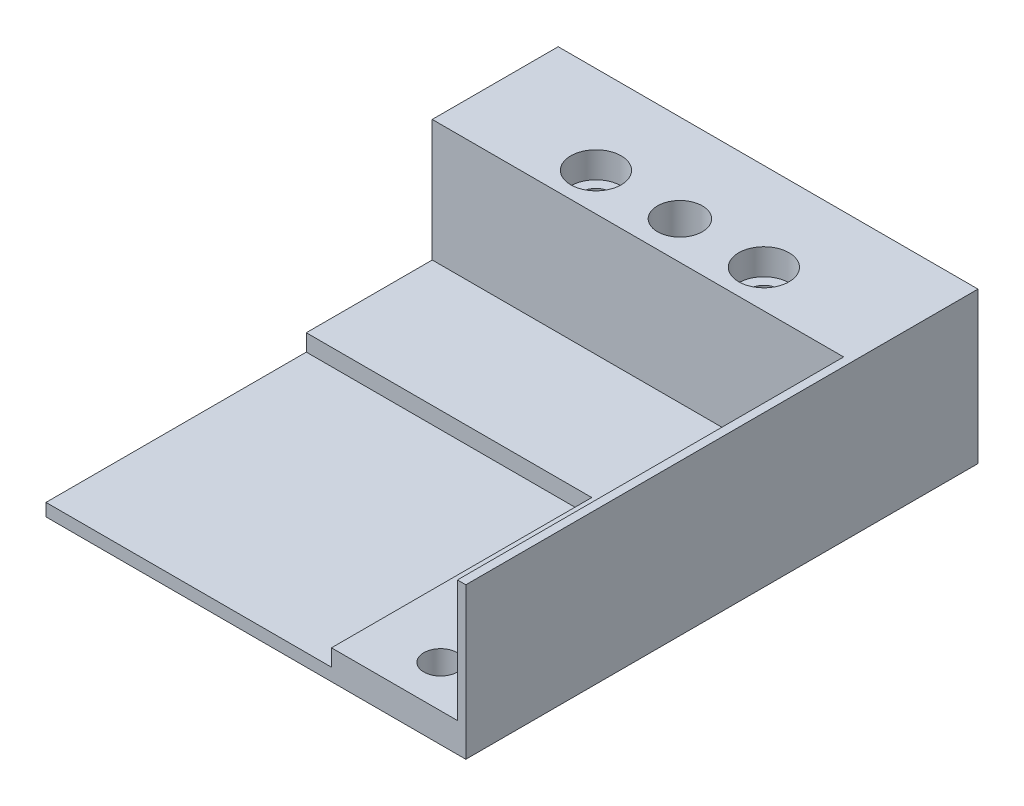
ISO-10303-21;
HEADER;
FILE_DESCRIPTION(('STEP AP214'),'2;1');
FILE_NAME('part.step','',(''),(''),'','','');
FILE_SCHEMA(('AUTOMOTIVE_DESIGN { 1 0 10303 214 1 1 1 1 }'));
ENDSEC;
DATA;
#1=APPLICATION_CONTEXT('core data for automotive mechanical design processes');
#2=APPLICATION_PROTOCOL_DEFINITION('international standard','automotive_design',2000,#1);
#3=PRODUCT_CONTEXT('',#1,'mechanical');
#4=PRODUCT('Part','Part','',(#3));
#5=PRODUCT_RELATED_PRODUCT_CATEGORY('part','',(#4));
#6=PRODUCT_DEFINITION_FORMATION('','',#4);
#7=PRODUCT_DEFINITION_CONTEXT('part definition',#1,'design');
#8=PRODUCT_DEFINITION('design','',#6,#7);
#9=PRODUCT_DEFINITION_SHAPE('','',#8);
#10=(LENGTH_UNIT() NAMED_UNIT(*) SI_UNIT(.MILLI.,.METRE.));
#11=(NAMED_UNIT(*) PLANE_ANGLE_UNIT() SI_UNIT($,.RADIAN.));
#12=(NAMED_UNIT(*) SI_UNIT($,.STERADIAN.) SOLID_ANGLE_UNIT());
#13=UNCERTAINTY_MEASURE_WITH_UNIT(LENGTH_MEASURE(1.E-05),#10,'distance_accuracy_value','');
#14=(GEOMETRIC_REPRESENTATION_CONTEXT(3) GLOBAL_UNCERTAINTY_ASSIGNED_CONTEXT((#13)) GLOBAL_UNIT_ASSIGNED_CONTEXT((#10,
#11,#12)) REPRESENTATION_CONTEXT('',''));
#15=CARTESIAN_POINT('',(0.,0.,0.));
#16=DIRECTION('',(0.,0.,1.));
#17=DIRECTION('',(1.,0.,0.));
#18=AXIS2_PLACEMENT_3D('',#15,#16,#17);
#19=CARTESIAN_POINT('',(25.,0.,-50.5));
#20=DIRECTION('',(0.,1.,0.));
#21=DIRECTION('',(0.,0.,1.));
#22=AXIS2_PLACEMENT_3D('',#19,#20,#21);
#23=CYLINDRICAL_SURFACE('',#22,2.675);
#24=CARTESIAN_POINT('',(25.,18.,-50.5));
#25=DIRECTION('',(0.,1.,0.));
#26=DIRECTION('',(0.,0.,1.));
#27=AXIS2_PLACEMENT_3D('',#24,#25,#26);
#28=CIRCLE('',#27,2.675);
#29=CARTESIAN_POINT('',(25.,18.,-47.825));
#30=VERTEX_POINT('',#29);
#31=EDGE_CURVE('E190',#30,#30,#28,.T.);
#32=ORIENTED_EDGE('',*,*,#31,.T.);
#33=EDGE_LOOP('',(#32));
#34=FACE_BOUND('',#33,.T.);
#35=CARTESIAN_POINT('',(25.,7.5,-50.5));
#36=DIRECTION('',(0.,-1.,0.));
#37=DIRECTION('',(0.,0.,-1.));
#38=AXIS2_PLACEMENT_3D('',#35,#36,#37);
#39=CIRCLE('',#38,2.675);
#40=CARTESIAN_POINT('',(25.,7.5,-53.175));
#41=VERTEX_POINT('',#40);
#42=EDGE_CURVE('E49',#41,#41,#39,.F.);
#43=ORIENTED_EDGE('',*,*,#42,.F.);
#44=EDGE_LOOP('',(#43));
#45=FACE_BOUND('',#44,.T.);
#46=ADVANCED_FACE('F45',(#34,#45),#23,.F.);
#47=CARTESIAN_POINT('',(15.,0.,-50.5));
#48=DIRECTION('',(0.,1.,0.));
#49=DIRECTION('',(0.,0.,1.));
#50=AXIS2_PLACEMENT_3D('',#47,#48,#49);
#51=CYLINDRICAL_SURFACE('',#50,1.75);
#52=CARTESIAN_POINT('',(15.,0.,-50.5));
#53=DIRECTION('',(0.,1.,0.));
#54=DIRECTION('',(0.,0.,1.));
#55=AXIS2_PLACEMENT_3D('',#52,#53,#54);
#56=CIRCLE('',#55,1.75);
#57=CARTESIAN_POINT('',(15.,0.,-48.75));
#58=VERTEX_POINT('',#57);
#59=EDGE_CURVE('E186',#58,#58,#56,.T.);
#60=ORIENTED_EDGE('',*,*,#59,.F.);
#61=EDGE_LOOP('',(#60));
#62=FACE_BOUND('',#61,.T.);
#63=CARTESIAN_POINT('',(15.,14.9,-50.5));
#64=DIRECTION('',(0.,1.,0.));
#65=DIRECTION('',(0.,0.,1.));
#66=AXIS2_PLACEMENT_3D('',#63,#64,#65);
#67=CIRCLE('',#66,1.75);
#68=CARTESIAN_POINT('',(15.,14.9,-48.75));
#69=VERTEX_POINT('',#68);
#70=EDGE_CURVE('E183',#69,#69,#67,.F.);
#71=ORIENTED_EDGE('',*,*,#70,.F.);
#72=EDGE_LOOP('',(#71));
#73=FACE_BOUND('',#72,.T.);
#74=ADVANCED_FACE('F270',(#62,#73),#51,.F.);
#75=CARTESIAN_POINT('',(35.,0.,-50.5));
#76=DIRECTION('',(0.,1.,0.));
#77=DIRECTION('',(0.,0.,1.));
#78=AXIS2_PLACEMENT_3D('',#75,#76,#77);
#79=CYLINDRICAL_SURFACE('',#78,1.75);
#80=CARTESIAN_POINT('',(35.,0.,-50.5));
#81=DIRECTION('',(0.,1.,0.));
#82=DIRECTION('',(0.,0.,1.));
#83=AXIS2_PLACEMENT_3D('',#80,#81,#82);
#84=CIRCLE('',#83,1.75);
#85=CARTESIAN_POINT('',(35.,0.,-48.75));
#86=VERTEX_POINT('',#85);
#87=EDGE_CURVE('E195',#86,#86,#84,.T.);
#88=ORIENTED_EDGE('',*,*,#87,.F.);
#89=EDGE_LOOP('',(#88));
#90=FACE_BOUND('',#89,.T.);
#91=CARTESIAN_POINT('',(35.,14.9,-50.5));
#92=DIRECTION('',(0.,1.,0.));
#93=DIRECTION('',(0.,0.,1.));
#94=AXIS2_PLACEMENT_3D('',#91,#92,#93);
#95=CIRCLE('',#94,1.75);
#96=CARTESIAN_POINT('',(35.,14.9,-48.75));
#97=VERTEX_POINT('',#96);
#98=EDGE_CURVE('E181',#97,#97,#95,.F.);
#99=ORIENTED_EDGE('',*,*,#98,.F.);
#100=EDGE_LOOP('',(#99));
#101=FACE_BOUND('',#100,.T.);
#102=ADVANCED_FACE('F277',(#90,#101),#79,.F.);
#103=CARTESIAN_POINT('',(0.,18.,0.));
#104=DIRECTION('',(0.,-1.,0.));
#105=DIRECTION('',(0.,0.,-1.));
#106=AXIS2_PLACEMENT_3D('',#103,#104,#105);
#107=PLANE('',#106);
#108=CARTESIAN_POINT('',(35.,18.,-50.5));
#109=DIRECTION('',(0.,1.,0.));
#110=DIRECTION('',(0.,0.,1.));
#111=AXIS2_PLACEMENT_3D('',#108,#109,#110);
#112=CIRCLE('',#111,3.);
#113=CARTESIAN_POINT('',(35.,18.,-47.5));
#114=VERTEX_POINT('',#113);
#115=EDGE_CURVE('E426',#114,#114,#112,.T.);
#116=ORIENTED_EDGE('',*,*,#115,.F.);
#117=EDGE_LOOP('',(#116));
#118=FACE_BOUND('',#117,.T.);
#119=CARTESIAN_POINT('',(15.,18.,-50.5));
#120=DIRECTION('',(0.,1.,0.));
#121=DIRECTION('',(0.,0.,1.));
#122=AXIS2_PLACEMENT_3D('',#119,#120,#121);
#123=CIRCLE('',#122,3.);
#124=CARTESIAN_POINT('',(15.,18.,-47.5));
#125=VERTEX_POINT('',#124);
#126=EDGE_CURVE('E429',#125,#125,#123,.T.);
#127=ORIENTED_EDGE('',*,*,#126,.F.);
#128=EDGE_LOOP('',(#127));
#129=FACE_BOUND('',#128,.T.);
#130=ORIENTED_EDGE('',*,*,#31,.F.);
#131=EDGE_LOOP('',(#130));
#132=FACE_BOUND('',#131,.T.);
#133=DIRECTION('',(0.,0.,1.));
#134=VECTOR('',#133,1.);
#135=CARTESIAN_POINT('',(0.,18.,0.));
#136=LINE('',#135,#134);
#137=CARTESIAN_POINT('',(0.,18.,-61.));
#138=VERTEX_POINT('',#137);
#139=CARTESIAN_POINT('',(0.,18.,-46.));
#140=VERTEX_POINT('',#139);
#141=EDGE_CURVE('E172',#138,#140,#136,.T.);
#142=ORIENTED_EDGE('',*,*,#141,.T.);
#143=DIRECTION('',(-1.,0.,0.));
#144=VECTOR('',#143,1.);
#145=CARTESIAN_POINT('',(0.,18.,-46.));
#146=LINE('',#145,#144);
#147=CARTESIAN_POINT('',(49.,18.,-46.));
#148=VERTEX_POINT('',#147);
#149=EDGE_CURVE('E214',#148,#140,#146,.T.);
#150=ORIENTED_EDGE('',*,*,#149,.F.);
#151=DIRECTION('',(0.,0.,-1.));
#152=VECTOR('',#151,1.);
#153=CARTESIAN_POINT('',(49.,18.,0.));
#154=LINE('',#153,#152);
#155=CARTESIAN_POINT('',(49.,18.,0.));
#156=VERTEX_POINT('',#155);
#157=EDGE_CURVE('E206',#156,#148,#154,.T.);
#158=ORIENTED_EDGE('',*,*,#157,.F.);
#159=DIRECTION('',(1.,0.,0.));
#160=VECTOR('',#159,1.);
#161=CARTESIAN_POINT('',(0.,18.,0.));
#162=LINE('',#161,#160);
#163=CARTESIAN_POINT('',(50.,18.,0.));
#164=VERTEX_POINT('',#163);
#165=EDGE_CURVE('E95',#156,#164,#162,.T.);
#166=ORIENTED_EDGE('',*,*,#165,.T.);
#167=DIRECTION('',(0.,0.,-1.));
#168=VECTOR('',#167,1.);
#169=CARTESIAN_POINT('',(50.,18.,0.));
#170=LINE('',#169,#168);
#171=CARTESIAN_POINT('',(50.,18.,-61.));
#172=VERTEX_POINT('',#171);
#173=EDGE_CURVE('E232',#164,#172,#170,.T.);
#174=ORIENTED_EDGE('',*,*,#173,.T.);
#175=DIRECTION('',(-1.,0.,0.));
#176=VECTOR('',#175,1.);
#177=CARTESIAN_POINT('',(0.,18.,-61.));
#178=LINE('',#177,#176);
#179=EDGE_CURVE('E71',#172,#138,#178,.T.);
#180=ORIENTED_EDGE('',*,*,#179,.T.);
#181=EDGE_LOOP('',(#142,#150,#158,#166,#174,#180));
#182=FACE_BOUND('',#181,.T.);
#183=ADVANCED_FACE('F235',(#118,#129,#132,#182),#107,.F.);
#184=CARTESIAN_POINT('',(0.,0.,0.));
#185=DIRECTION('',(0.,-1.,0.));
#186=DIRECTION('',(0.,0.,-1.));
#187=AXIS2_PLACEMENT_3D('',#184,#185,#186);
#188=PLANE('',#187);
#189=CARTESIAN_POINT('',(25.,0.,-50.5));
#190=DIRECTION('',(0.,-1.,0.));
#191=DIRECTION('',(0.,0.,-1.));
#192=AXIS2_PLACEMENT_3D('',#189,#190,#191);
#193=CIRCLE('',#192,4.125);
#194=CARTESIAN_POINT('',(25.,0.,-54.625));
#195=VERTEX_POINT('',#194);
#196=EDGE_CURVE('E420',#195,#195,#193,.T.);
#197=ORIENTED_EDGE('',*,*,#196,.F.);
#198=EDGE_LOOP('',(#197));
#199=FACE_BOUND('',#198,.T.);
#200=ORIENTED_EDGE('',*,*,#87,.T.);
#201=EDGE_LOOP('',(#200));
#202=FACE_BOUND('',#201,.T.);
#203=ORIENTED_EDGE('',*,*,#59,.T.);
#204=EDGE_LOOP('',(#203));
#205=FACE_BOUND('',#204,.T.);
#206=DIRECTION('',(0.,0.,1.));
#207=VECTOR('',#206,1.);
#208=CARTESIAN_POINT('',(0.,0.,0.));
#209=LINE('',#208,#207);
#210=CARTESIAN_POINT('',(0.,0.,-61.));
#211=VERTEX_POINT('',#210);
#212=CARTESIAN_POINT('',(0.,0.,0.));
#213=VERTEX_POINT('',#212);
#214=EDGE_CURVE('E155',#211,#213,#209,.T.);
#215=ORIENTED_EDGE('',*,*,#214,.F.);
#216=DIRECTION('',(-1.,0.,0.));
#217=VECTOR('',#216,1.);
#218=CARTESIAN_POINT('',(0.,0.,-61.));
#219=LINE('',#218,#217);
#220=CARTESIAN_POINT('',(50.,0.,-61.));
#221=VERTEX_POINT('',#220);
#222=EDGE_CURVE('E90',#221,#211,#219,.T.);
#223=ORIENTED_EDGE('',*,*,#222,.F.);
#224=DIRECTION('',(0.,0.,-1.));
#225=VECTOR('',#224,1.);
#226=CARTESIAN_POINT('',(50.,0.,0.));
#227=LINE('',#226,#225);
#228=CARTESIAN_POINT('',(50.,0.,0.));
#229=VERTEX_POINT('',#228);
#230=EDGE_CURVE('E162',#229,#221,#227,.T.);
#231=ORIENTED_EDGE('',*,*,#230,.F.);
#232=DIRECTION('',(1.,0.,0.));
#233=VECTOR('',#232,1.);
#234=CARTESIAN_POINT('',(0.,0.,0.));
#235=LINE('',#234,#233);
#236=EDGE_CURVE('E159',#213,#229,#235,.T.);
#237=ORIENTED_EDGE('',*,*,#236,.F.);
#238=EDGE_LOOP('',(#215,#223,#231,#237));
#239=FACE_BOUND('',#238,.T.);
#240=CARTESIAN_POINT('',(42.,0.,-5.));
#241=DIRECTION('',(0.,1.,0.));
#242=DIRECTION('',(0.,0.,1.));
#243=AXIS2_PLACEMENT_3D('',#240,#241,#242);
#244=CIRCLE('',#243,2.);
#245=CARTESIAN_POINT('',(42.,0.,-3.));
#246=VERTEX_POINT('',#245);
#247=EDGE_CURVE('E160',#246,#246,#244,.T.);
#248=ORIENTED_EDGE('',*,*,#247,.T.);
#249=EDGE_LOOP('',(#248));
#250=FACE_BOUND('',#249,.T.);
#251=ADVANCED_FACE('F249',(#199,#202,#205,#239,#250),#188,.T.);
#252=CARTESIAN_POINT('',(0.,18.,0.));
#253=DIRECTION('',(1.,0.,0.));
#254=DIRECTION('',(0.,0.,-1.));
#255=AXIS2_PLACEMENT_3D('',#252,#253,#254);
#256=PLANE('',#255);
#257=DIRECTION('',(0.,0.,1.));
#258=VECTOR('',#257,1.);
#259=CARTESIAN_POINT('',(0.,1.5,0.));
#260=LINE('',#259,#258);
#261=CARTESIAN_POINT('',(0.,1.5,-31.));
#262=VERTEX_POINT('',#261);
#263=CARTESIAN_POINT('',(0.,1.5,0.));
#264=VERTEX_POINT('',#263);
#265=EDGE_CURVE('E135',#262,#264,#260,.T.);
#266=ORIENTED_EDGE('',*,*,#265,.F.);
#267=DIRECTION('',(0.,1.,0.));
#268=VECTOR('',#267,1.);
#269=CARTESIAN_POINT('',(0.,1.5,-31.));
#270=LINE('',#269,#268);
#271=CARTESIAN_POINT('',(0.,3.5,-31.));
#272=VERTEX_POINT('',#271);
#273=EDGE_CURVE('E204',#262,#272,#270,.T.);
#274=ORIENTED_EDGE('',*,*,#273,.T.);
#275=DIRECTION('',(0.,0.,1.));
#276=VECTOR('',#275,1.);
#277=CARTESIAN_POINT('',(0.,3.5,0.));
#278=LINE('',#277,#276);
#279=CARTESIAN_POINT('',(0.,3.5,-46.));
#280=VERTEX_POINT('',#279);
#281=EDGE_CURVE('E210',#280,#272,#278,.T.);
#282=ORIENTED_EDGE('',*,*,#281,.F.);
#283=DIRECTION('',(0.,1.,0.));
#284=VECTOR('',#283,1.);
#285=CARTESIAN_POINT('',(0.,3.5,-46.));
#286=LINE('',#285,#284);
#287=EDGE_CURVE('E180',#280,#140,#286,.T.);
#288=ORIENTED_EDGE('',*,*,#287,.T.);
#289=ORIENTED_EDGE('',*,*,#141,.F.);
#290=DIRECTION('',(0.,-1.,0.));
#291=VECTOR('',#290,1.);
#292=CARTESIAN_POINT('',(0.,18.,-61.));
#293=LINE('',#292,#291);
#294=EDGE_CURVE('E157',#138,#211,#293,.T.);
#295=ORIENTED_EDGE('',*,*,#294,.T.);
#296=ORIENTED_EDGE('',*,*,#214,.T.);
#297=DIRECTION('',(0.,-1.,0.));
#298=VECTOR('',#297,1.);
#299=CARTESIAN_POINT('',(0.,18.,0.));
#300=LINE('',#299,#298);
#301=EDGE_CURVE('E11',#264,#213,#300,.T.);
#302=ORIENTED_EDGE('',*,*,#301,.F.);
#303=EDGE_LOOP('',(#266,#274,#282,#288,#289,#295,#296,#302));
#304=FACE_BOUND('',#303,.T.);
#305=ADVANCED_FACE('F47',(#304),#256,.F.);
#306=CARTESIAN_POINT('',(0.,18.,0.));
#307=DIRECTION('',(0.,0.,-1.));
#308=DIRECTION('',(-1.,0.,0.));
#309=AXIS2_PLACEMENT_3D('',#306,#307,#308);
#310=PLANE('',#309);
#311=DIRECTION('',(1.,0.,0.));
#312=VECTOR('',#311,1.);
#313=CARTESIAN_POINT('',(0.,3.5,0.));
#314=LINE('',#313,#312);
#315=CARTESIAN_POINT('',(34.,3.5,0.));
#316=VERTEX_POINT('',#315);
#317=CARTESIAN_POINT('',(49.,3.5,0.));
#318=VERTEX_POINT('',#317);
#319=EDGE_CURVE('E213',#316,#318,#314,.T.);
#320=ORIENTED_EDGE('',*,*,#319,.F.);
#321=DIRECTION('',(0.,1.,0.));
#322=VECTOR('',#321,1.);
#323=CARTESIAN_POINT('',(34.,1.5,0.));
#324=LINE('',#323,#322);
#325=CARTESIAN_POINT('',(34.,1.5,0.));
#326=VERTEX_POINT('',#325);
#327=EDGE_CURVE('E62',#326,#316,#324,.T.);
#328=ORIENTED_EDGE('',*,*,#327,.F.);
#329=DIRECTION('',(1.,0.,0.));
#330=VECTOR('',#329,1.);
#331=CARTESIAN_POINT('',(0.,1.5,0.));
#332=LINE('',#331,#330);
#333=EDGE_CURVE('E139',#264,#326,#332,.T.);
#334=ORIENTED_EDGE('',*,*,#333,.F.);
#335=ORIENTED_EDGE('',*,*,#301,.T.);
#336=ORIENTED_EDGE('',*,*,#236,.T.);
#337=DIRECTION('',(0.,-1.,0.));
#338=VECTOR('',#337,1.);
#339=CARTESIAN_POINT('',(50.,18.,0.));
#340=LINE('',#339,#338);
#341=EDGE_CURVE('E54',#164,#229,#340,.T.);
#342=ORIENTED_EDGE('',*,*,#341,.F.);
#343=ORIENTED_EDGE('',*,*,#165,.F.);
#344=DIRECTION('',(0.,1.,0.));
#345=VECTOR('',#344,1.);
#346=CARTESIAN_POINT('',(49.,3.5,0.));
#347=LINE('',#346,#345);
#348=EDGE_CURVE('E222',#318,#156,#347,.T.);
#349=ORIENTED_EDGE('',*,*,#348,.F.);
#350=EDGE_LOOP('',(#320,#328,#334,#335,#336,#342,#343,#349));
#351=FACE_BOUND('',#350,.T.);
#352=ADVANCED_FACE('F149',(#351),#310,.F.);
#353=CARTESIAN_POINT('',(50.,18.,0.));
#354=DIRECTION('',(-1.,0.,0.));
#355=DIRECTION('',(0.,0.,1.));
#356=AXIS2_PLACEMENT_3D('',#353,#354,#355);
#357=PLANE('',#356);
#358=ORIENTED_EDGE('',*,*,#230,.T.);
#359=DIRECTION('',(0.,-1.,0.));
#360=VECTOR('',#359,1.);
#361=CARTESIAN_POINT('',(50.,18.,-61.));
#362=LINE('',#361,#360);
#363=EDGE_CURVE('E174',#172,#221,#362,.T.);
#364=ORIENTED_EDGE('',*,*,#363,.F.);
#365=ORIENTED_EDGE('',*,*,#173,.F.);
#366=ORIENTED_EDGE('',*,*,#341,.T.);
#367=EDGE_LOOP('',(#358,#364,#365,#366));
#368=FACE_BOUND('',#367,.T.);
#369=ADVANCED_FACE('F237',(#368),#357,.F.);
#370=CARTESIAN_POINT('',(0.,18.,-61.));
#371=DIRECTION('',(0.,0.,1.));
#372=DIRECTION('',(1.,0.,0.));
#373=AXIS2_PLACEMENT_3D('',#370,#371,#372);
#374=PLANE('',#373);
#375=ORIENTED_EDGE('',*,*,#222,.T.);
#376=ORIENTED_EDGE('',*,*,#294,.F.);
#377=ORIENTED_EDGE('',*,*,#179,.F.);
#378=ORIENTED_EDGE('',*,*,#363,.T.);
#379=EDGE_LOOP('',(#375,#376,#377,#378));
#380=FACE_BOUND('',#379,.T.);
#381=ADVANCED_FACE('F239',(#380),#374,.F.);
#382=CARTESIAN_POINT('',(42.,18.,-5.));
#383=DIRECTION('',(0.,-1.,0.));
#384=DIRECTION('',(0.,0.,-1.));
#385=AXIS2_PLACEMENT_3D('',#382,#383,#384);
#386=CYLINDRICAL_SURFACE('',#385,2.);
#387=CARTESIAN_POINT('',(42.,3.5,-5.));
#388=DIRECTION('',(0.,-1.,0.));
#389=DIRECTION('',(0.,0.,-1.));
#390=AXIS2_PLACEMENT_3D('',#387,#388,#389);
#391=CIRCLE('',#390,2.);
#392=CARTESIAN_POINT('',(42.,3.5,-7.));
#393=VERTEX_POINT('',#392);
#394=EDGE_CURVE('E165',#393,#393,#391,.T.);
#395=ORIENTED_EDGE('',*,*,#394,.F.);
#396=EDGE_LOOP('',(#395));
#397=FACE_BOUND('',#396,.T.);
#398=ORIENTED_EDGE('',*,*,#247,.F.);
#399=EDGE_LOOP('',(#398));
#400=FACE_BOUND('',#399,.T.);
#401=ADVANCED_FACE('F256',(#397,#400),#386,.F.);
#402=CARTESIAN_POINT('',(0.,3.5,-46.));
#403=DIRECTION('',(0.,0.,-1.));
#404=DIRECTION('',(-1.,0.,0.));
#405=AXIS2_PLACEMENT_3D('',#402,#403,#404);
#406=PLANE('',#405);
#407=ORIENTED_EDGE('',*,*,#149,.T.);
#408=ORIENTED_EDGE('',*,*,#287,.F.);
#409=DIRECTION('',(-1.,0.,0.));
#410=VECTOR('',#409,1.);
#411=CARTESIAN_POINT('',(0.,3.5,-46.));
#412=LINE('',#411,#410);
#413=CARTESIAN_POINT('',(49.,3.5,-46.));
#414=VERTEX_POINT('',#413);
#415=EDGE_CURVE('E219',#414,#280,#412,.T.);
#416=ORIENTED_EDGE('',*,*,#415,.F.);
#417=DIRECTION('',(0.,1.,0.));
#418=VECTOR('',#417,1.);
#419=CARTESIAN_POINT('',(49.,3.5,-46.));
#420=LINE('',#419,#418);
#421=EDGE_CURVE('E228',#414,#148,#420,.T.);
#422=ORIENTED_EDGE('',*,*,#421,.T.);
#423=EDGE_LOOP('',(#407,#408,#416,#422));
#424=FACE_BOUND('',#423,.T.);
#425=ADVANCED_FACE('F243',(#424),#406,.F.);
#426=CARTESIAN_POINT('',(49.,3.5,0.));
#427=DIRECTION('',(1.,0.,0.));
#428=DIRECTION('',(0.,0.,-1.));
#429=AXIS2_PLACEMENT_3D('',#426,#427,#428);
#430=PLANE('',#429);
#431=ORIENTED_EDGE('',*,*,#157,.T.);
#432=ORIENTED_EDGE('',*,*,#421,.F.);
#433=DIRECTION('',(0.,0.,-1.));
#434=VECTOR('',#433,1.);
#435=CARTESIAN_POINT('',(49.,3.5,0.));
#436=LINE('',#435,#434);
#437=EDGE_CURVE('E216',#318,#414,#436,.T.);
#438=ORIENTED_EDGE('',*,*,#437,.F.);
#439=ORIENTED_EDGE('',*,*,#348,.T.);
#440=EDGE_LOOP('',(#431,#432,#438,#439));
#441=FACE_BOUND('',#440,.T.);
#442=ADVANCED_FACE('F247',(#441),#430,.F.);
#443=CARTESIAN_POINT('',(0.,3.5,0.));
#444=DIRECTION('',(0.,-1.,0.));
#445=DIRECTION('',(0.,0.,-1.));
#446=AXIS2_PLACEMENT_3D('',#443,#444,#445);
#447=PLANE('',#446);
#448=ORIENTED_EDGE('',*,*,#394,.T.);
#449=EDGE_LOOP('',(#448));
#450=FACE_BOUND('',#449,.T.);
#451=ORIENTED_EDGE('',*,*,#281,.T.);
#452=DIRECTION('',(-1.,0.,0.));
#453=VECTOR('',#452,1.);
#454=CARTESIAN_POINT('',(0.,3.5,-31.));
#455=LINE('',#454,#453);
#456=CARTESIAN_POINT('',(34.,3.5,-31.));
#457=VERTEX_POINT('',#456);
#458=EDGE_CURVE('E145',#457,#272,#455,.T.);
#459=ORIENTED_EDGE('',*,*,#458,.F.);
#460=DIRECTION('',(0.,0.,-1.));
#461=VECTOR('',#460,1.);
#462=CARTESIAN_POINT('',(34.,3.5,0.));
#463=LINE('',#462,#461);
#464=EDGE_CURVE('E201',#316,#457,#463,.T.);
#465=ORIENTED_EDGE('',*,*,#464,.F.);
#466=ORIENTED_EDGE('',*,*,#319,.T.);
#467=ORIENTED_EDGE('',*,*,#437,.T.);
#468=ORIENTED_EDGE('',*,*,#415,.T.);
#469=EDGE_LOOP('',(#451,#459,#465,#466,#467,#468));
#470=FACE_BOUND('',#469,.T.);
#471=ADVANCED_FACE('F291',(#450,#470),#447,.F.);
#472=CARTESIAN_POINT('',(0.,1.5,-31.));
#473=DIRECTION('',(0.,0.,-1.));
#474=DIRECTION('',(-1.,0.,0.));
#475=AXIS2_PLACEMENT_3D('',#472,#473,#474);
#476=PLANE('',#475);
#477=ORIENTED_EDGE('',*,*,#458,.T.);
#478=ORIENTED_EDGE('',*,*,#273,.F.);
#479=DIRECTION('',(-1.,0.,0.));
#480=VECTOR('',#479,1.);
#481=CARTESIAN_POINT('',(0.,1.5,-31.));
#482=LINE('',#481,#480);
#483=CARTESIAN_POINT('',(34.,1.5,-31.));
#484=VERTEX_POINT('',#483);
#485=EDGE_CURVE('E141',#484,#262,#482,.T.);
#486=ORIENTED_EDGE('',*,*,#485,.F.);
#487=DIRECTION('',(0.,1.,0.));
#488=VECTOR('',#487,1.);
#489=CARTESIAN_POINT('',(34.,1.5,-31.));
#490=LINE('',#489,#488);
#491=EDGE_CURVE('E207',#484,#457,#490,.T.);
#492=ORIENTED_EDGE('',*,*,#491,.T.);
#493=EDGE_LOOP('',(#477,#478,#486,#492));
#494=FACE_BOUND('',#493,.T.);
#495=ADVANCED_FACE('F288',(#494),#476,.F.);
#496=CARTESIAN_POINT('',(34.,1.5,0.));
#497=DIRECTION('',(1.,0.,0.));
#498=DIRECTION('',(0.,0.,-1.));
#499=AXIS2_PLACEMENT_3D('',#496,#497,#498);
#500=PLANE('',#499);
#501=ORIENTED_EDGE('',*,*,#464,.T.);
#502=ORIENTED_EDGE('',*,*,#491,.F.);
#503=DIRECTION('',(0.,0.,-1.));
#504=VECTOR('',#503,1.);
#505=CARTESIAN_POINT('',(34.,1.5,0.));
#506=LINE('',#505,#504);
#507=EDGE_CURVE('E151',#326,#484,#506,.T.);
#508=ORIENTED_EDGE('',*,*,#507,.F.);
#509=ORIENTED_EDGE('',*,*,#327,.T.);
#510=EDGE_LOOP('',(#501,#502,#508,#509));
#511=FACE_BOUND('',#510,.T.);
#512=ADVANCED_FACE('F287',(#511),#500,.F.);
#513=CARTESIAN_POINT('',(0.,1.5,0.));
#514=DIRECTION('',(0.,-1.,0.));
#515=DIRECTION('',(0.,0.,-1.));
#516=AXIS2_PLACEMENT_3D('',#513,#514,#515);
#517=PLANE('',#516);
#518=ORIENTED_EDGE('',*,*,#265,.T.);
#519=ORIENTED_EDGE('',*,*,#333,.T.);
#520=ORIENTED_EDGE('',*,*,#507,.T.);
#521=ORIENTED_EDGE('',*,*,#485,.T.);
#522=EDGE_LOOP('',(#518,#519,#520,#521));
#523=FACE_BOUND('',#522,.T.);
#524=ADVANCED_FACE('F137',(#523),#517,.F.);
#525=CARTESIAN_POINT('',(35.,14.9,-50.5));
#526=DIRECTION('',(0.,1.,0.));
#527=DIRECTION('',(0.,0.,1.));
#528=AXIS2_PLACEMENT_3D('',#525,#526,#527);
#529=PLANE('',#528);
#530=CARTESIAN_POINT('',(35.,14.9,-50.5));
#531=DIRECTION('',(0.,1.,0.));
#532=DIRECTION('',(0.,0.,1.));
#533=AXIS2_PLACEMENT_3D('',#530,#531,#532);
#534=CIRCLE('',#533,3.);
#535=CARTESIAN_POINT('',(35.,14.9,-47.5));
#536=VERTEX_POINT('',#535);
#537=EDGE_CURVE('E184',#536,#536,#534,.T.);
#538=ORIENTED_EDGE('',*,*,#537,.T.);
#539=EDGE_LOOP('',(#538));
#540=FACE_BOUND('',#539,.T.);
#541=ORIENTED_EDGE('',*,*,#98,.T.);
#542=EDGE_LOOP('',(#541));
#543=FACE_BOUND('',#542,.T.);
#544=ADVANCED_FACE('F286',(#540,#543),#529,.T.);
#545=CARTESIAN_POINT('',(35.,14.9,-50.5));
#546=DIRECTION('',(0.,1.,0.));
#547=DIRECTION('',(0.,0.,1.));
#548=AXIS2_PLACEMENT_3D('',#545,#546,#547);
#549=CYLINDRICAL_SURFACE('',#548,3.);
#550=CARTESIAN_POINT('',(35.,14.9,-47.5));
#551=CARTESIAN_POINT('',(35.,14.9322916666667,-47.5));
#552=CARTESIAN_POINT('',(35.,14.9645833333333,-47.5));
#553=CARTESIAN_POINT('',(35.,15.0291666666667,-47.5));
#554=CARTESIAN_POINT('',(35.,15.0614583333333,-47.5));
#555=CARTESIAN_POINT('',(35.,15.1260416666667,-47.5));
#556=CARTESIAN_POINT('',(35.,15.1583333333333,-47.5));
#557=CARTESIAN_POINT('',(35.,15.2229166666667,-47.5));
#558=CARTESIAN_POINT('',(35.,15.2552083333333,-47.5));
#559=CARTESIAN_POINT('',(35.,15.3197916666667,-47.5));
#560=CARTESIAN_POINT('',(35.,15.3520833333333,-47.5));
#561=CARTESIAN_POINT('',(35.,15.4166666666667,-47.5));
#562=CARTESIAN_POINT('',(35.,15.4489583333333,-47.5));
#563=CARTESIAN_POINT('',(35.,15.5135416666667,-47.5));
#564=CARTESIAN_POINT('',(35.,15.5458333333333,-47.5));
#565=CARTESIAN_POINT('',(35.,15.6104166666667,-47.5));
#566=CARTESIAN_POINT('',(35.,15.6427083333333,-47.5));
#567=CARTESIAN_POINT('',(35.,15.7072916666667,-47.5));
#568=CARTESIAN_POINT('',(35.,15.7395833333333,-47.5));
#569=CARTESIAN_POINT('',(35.,15.8041666666667,-47.5));
#570=CARTESIAN_POINT('',(35.,15.8364583333333,-47.5));
#571=CARTESIAN_POINT('',(35.,15.9010416666667,-47.5));
#572=CARTESIAN_POINT('',(35.,15.9333333333333,-47.5));
#573=CARTESIAN_POINT('',(35.,15.9979166666667,-47.5));
#574=CARTESIAN_POINT('',(35.,16.0302083333333,-47.5));
#575=CARTESIAN_POINT('',(35.,16.0947916666667,-47.5));
#576=CARTESIAN_POINT('',(35.,16.1270833333333,-47.5));
#577=CARTESIAN_POINT('',(35.,16.1916666666667,-47.5));
#578=CARTESIAN_POINT('',(35.,16.2239583333333,-47.5));
#579=CARTESIAN_POINT('',(35.,16.2885416666667,-47.5));
#580=CARTESIAN_POINT('',(35.,16.3208333333333,-47.5));
#581=CARTESIAN_POINT('',(35.,16.3854166666667,-47.5));
#582=CARTESIAN_POINT('',(35.,16.4177083333333,-47.5));
#583=CARTESIAN_POINT('',(35.,16.4822916666667,-47.5));
#584=CARTESIAN_POINT('',(35.,16.5145833333333,-47.5));
#585=CARTESIAN_POINT('',(35.,16.5791666666667,-47.5));
#586=CARTESIAN_POINT('',(35.,16.6114583333333,-47.5));
#587=CARTESIAN_POINT('',(35.,16.6760416666667,-47.5));
#588=CARTESIAN_POINT('',(35.,16.7083333333333,-47.5));
#589=CARTESIAN_POINT('',(35.,16.7729166666667,-47.5));
#590=CARTESIAN_POINT('',(35.,16.8052083333333,-47.5));
#591=CARTESIAN_POINT('',(35.,16.8697916666667,-47.5));
#592=CARTESIAN_POINT('',(35.,16.9020833333333,-47.5));
#593=CARTESIAN_POINT('',(35.,16.9666666666667,-47.5));
#594=CARTESIAN_POINT('',(35.,16.9989583333333,-47.5));
#595=CARTESIAN_POINT('',(35.,17.0635416666667,-47.5));
#596=CARTESIAN_POINT('',(35.,17.0958333333333,-47.5));
#597=CARTESIAN_POINT('',(35.,17.1604166666667,-47.5));
#598=CARTESIAN_POINT('',(35.,17.1927083333333,-47.5));
#599=CARTESIAN_POINT('',(35.,17.2572916666667,-47.5));
#600=CARTESIAN_POINT('',(35.,17.2895833333333,-47.5));
#601=CARTESIAN_POINT('',(35.,17.3541666666667,-47.5));
#602=CARTESIAN_POINT('',(35.,17.3864583333333,-47.5));
#603=CARTESIAN_POINT('',(35.,17.4510416666667,-47.5));
#604=CARTESIAN_POINT('',(35.,17.4833333333333,-47.5));
#605=CARTESIAN_POINT('',(35.,17.5479166666667,-47.5));
#606=CARTESIAN_POINT('',(35.,17.5802083333333,-47.5));
#607=CARTESIAN_POINT('',(35.,17.6447916666667,-47.5));
#608=CARTESIAN_POINT('',(35.,17.6770833333333,-47.5));
#609=CARTESIAN_POINT('',(35.,17.7416666666667,-47.5));
#610=CARTESIAN_POINT('',(35.,17.7739583333333,-47.5));
#611=CARTESIAN_POINT('',(35.,17.8385416666667,-47.5));
#612=CARTESIAN_POINT('',(35.,17.8708333333333,-47.5));
#613=CARTESIAN_POINT('',(35.,17.9354166666667,-47.5));
#614=CARTESIAN_POINT('',(35.,17.9677083333333,-47.5));
#615=CARTESIAN_POINT('',(35.,18.,-47.5));
#616=B_SPLINE_CURVE_WITH_KNOTS('',3,(#550,#551,#552,#553,#554,#555,#556,#557,#558,#559,#560,
#561,#562,#563,#564,#565,#566,#567,#568,#569,#570,#571,#572,#573,#574,#575,#576,#577,#578,#579,
#580,#581,#582,#583,#584,#585,#586,#587,#588,#589,#590,#591,#592,#593,#594,#595,#596,#597,#598,
#599,#600,#601,#602,#603,#604,#605,#606,#607,#608,#609,#610,#611,#612,#613,#614,#615),
.UNSPECIFIED.,.F.,.F.,(4,2,2,2,2,2,2,2,2,2,2,2,2,2,2,2,2,2,2,2,2,2,2,2,2,2,2,2,2,2,2,2,4),(0.,
0.0968750000000015,0.193750000000001,0.290625000000001,0.387500000000001,0.484375,0.58125,
0.678125000000002,0.775000000000001,0.871875000000001,0.968750000000001,1.065625,1.1625,
1.259375,1.35625,1.453125,1.55,1.646875,1.74375,1.840625,1.9375,2.034375,2.13125,2.228125,2.325,
2.421875,2.51875,2.615625,2.7125,2.809375,2.90625,3.003125,3.1),.UNSPECIFIED.);
#617=EDGE_CURVE('BSEAM361',#536,#114,#616,.T.);
#618=ORIENTED_EDGE('',*,*,#537,.F.);
#619=ORIENTED_EDGE('',*,*,#115,.T.);
#620=ORIENTED_EDGE('',*,*,#617,.T.);
#621=ORIENTED_EDGE('',*,*,#617,.F.);
#622=EDGE_LOOP('',(#618,#620,#619,#621));
#623=FACE_BOUND('',#622,.T.);
#624=ADVANCED_FACE('F361',(#623),#549,.F.);
#625=CARTESIAN_POINT('',(15.,14.9,-50.5));
#626=DIRECTION('',(0.,1.,0.));
#627=DIRECTION('',(0.,0.,1.));
#628=AXIS2_PLACEMENT_3D('',#625,#626,#627);
#629=PLANE('',#628);
#630=CARTESIAN_POINT('',(15.,14.9,-50.5));
#631=DIRECTION('',(0.,1.,0.));
#632=DIRECTION('',(0.,0.,1.));
#633=AXIS2_PLACEMENT_3D('',#630,#631,#632);
#634=CIRCLE('',#633,3.);
#635=CARTESIAN_POINT('',(15.,14.9,-47.5));
#636=VERTEX_POINT('',#635);
#637=EDGE_CURVE('E432',#636,#636,#634,.T.);
#638=ORIENTED_EDGE('',*,*,#637,.T.);
#639=EDGE_LOOP('',(#638));
#640=FACE_BOUND('',#639,.T.);
#641=ORIENTED_EDGE('',*,*,#70,.T.);
#642=EDGE_LOOP('',(#641));
#643=FACE_BOUND('',#642,.T.);
#644=ADVANCED_FACE('F369',(#640,#643),#629,.T.);
#645=CARTESIAN_POINT('',(15.,14.9,-50.5));
#646=DIRECTION('',(0.,1.,0.));
#647=DIRECTION('',(0.,0.,1.));
#648=AXIS2_PLACEMENT_3D('',#645,#646,#647);
#649=CYLINDRICAL_SURFACE('',#648,3.);
#650=CARTESIAN_POINT('',(15.,14.9,-47.5));
#651=CARTESIAN_POINT('',(15.,14.9322916666667,-47.5));
#652=CARTESIAN_POINT('',(15.,14.9645833333333,-47.5));
#653=CARTESIAN_POINT('',(15.,15.0291666666667,-47.5));
#654=CARTESIAN_POINT('',(15.,15.0614583333333,-47.5));
#655=CARTESIAN_POINT('',(15.,15.1260416666667,-47.5));
#656=CARTESIAN_POINT('',(15.,15.1583333333333,-47.5));
#657=CARTESIAN_POINT('',(15.,15.2229166666667,-47.5));
#658=CARTESIAN_POINT('',(15.,15.2552083333333,-47.5));
#659=CARTESIAN_POINT('',(15.,15.3197916666667,-47.5));
#660=CARTESIAN_POINT('',(15.,15.3520833333333,-47.5));
#661=CARTESIAN_POINT('',(15.,15.4166666666667,-47.5));
#662=CARTESIAN_POINT('',(15.,15.4489583333333,-47.5));
#663=CARTESIAN_POINT('',(15.,15.5135416666667,-47.5));
#664=CARTESIAN_POINT('',(15.,15.5458333333333,-47.5));
#665=CARTESIAN_POINT('',(15.,15.6104166666667,-47.5));
#666=CARTESIAN_POINT('',(15.,15.6427083333333,-47.5));
#667=CARTESIAN_POINT('',(15.,15.7072916666667,-47.5));
#668=CARTESIAN_POINT('',(15.,15.7395833333333,-47.5));
#669=CARTESIAN_POINT('',(15.,15.8041666666667,-47.5));
#670=CARTESIAN_POINT('',(15.,15.8364583333333,-47.5));
#671=CARTESIAN_POINT('',(15.,15.9010416666667,-47.5));
#672=CARTESIAN_POINT('',(15.,15.9333333333333,-47.5));
#673=CARTESIAN_POINT('',(15.,15.9979166666667,-47.5));
#674=CARTESIAN_POINT('',(15.,16.0302083333333,-47.5));
#675=CARTESIAN_POINT('',(15.,16.0947916666667,-47.5));
#676=CARTESIAN_POINT('',(15.,16.1270833333333,-47.5));
#677=CARTESIAN_POINT('',(15.,16.1916666666667,-47.5));
#678=CARTESIAN_POINT('',(15.,16.2239583333333,-47.5));
#679=CARTESIAN_POINT('',(15.,16.2885416666667,-47.5));
#680=CARTESIAN_POINT('',(15.,16.3208333333333,-47.5));
#681=CARTESIAN_POINT('',(15.,16.3854166666667,-47.5));
#682=CARTESIAN_POINT('',(15.,16.4177083333333,-47.5));
#683=CARTESIAN_POINT('',(15.,16.4822916666667,-47.5));
#684=CARTESIAN_POINT('',(15.,16.5145833333333,-47.5));
#685=CARTESIAN_POINT('',(15.,16.5791666666667,-47.5));
#686=CARTESIAN_POINT('',(15.,16.6114583333333,-47.5));
#687=CARTESIAN_POINT('',(15.,16.6760416666667,-47.5));
#688=CARTESIAN_POINT('',(15.,16.7083333333333,-47.5));
#689=CARTESIAN_POINT('',(15.,16.7729166666667,-47.5));
#690=CARTESIAN_POINT('',(15.,16.8052083333333,-47.5));
#691=CARTESIAN_POINT('',(15.,16.8697916666667,-47.5));
#692=CARTESIAN_POINT('',(15.,16.9020833333333,-47.5));
#693=CARTESIAN_POINT('',(15.,16.9666666666667,-47.5));
#694=CARTESIAN_POINT('',(15.,16.9989583333333,-47.5));
#695=CARTESIAN_POINT('',(15.,17.0635416666667,-47.5));
#696=CARTESIAN_POINT('',(15.,17.0958333333333,-47.5));
#697=CARTESIAN_POINT('',(15.,17.1604166666667,-47.5));
#698=CARTESIAN_POINT('',(15.,17.1927083333333,-47.5));
#699=CARTESIAN_POINT('',(15.,17.2572916666667,-47.5));
#700=CARTESIAN_POINT('',(15.,17.2895833333333,-47.5));
#701=CARTESIAN_POINT('',(15.,17.3541666666667,-47.5));
#702=CARTESIAN_POINT('',(15.,17.3864583333333,-47.5));
#703=CARTESIAN_POINT('',(15.,17.4510416666667,-47.5));
#704=CARTESIAN_POINT('',(15.,17.4833333333333,-47.5));
#705=CARTESIAN_POINT('',(15.,17.5479166666667,-47.5));
#706=CARTESIAN_POINT('',(15.,17.5802083333333,-47.5));
#707=CARTESIAN_POINT('',(15.,17.6447916666667,-47.5));
#708=CARTESIAN_POINT('',(15.,17.6770833333333,-47.5));
#709=CARTESIAN_POINT('',(15.,17.7416666666667,-47.5));
#710=CARTESIAN_POINT('',(15.,17.7739583333333,-47.5));
#711=CARTESIAN_POINT('',(15.,17.8385416666667,-47.5));
#712=CARTESIAN_POINT('',(15.,17.8708333333333,-47.5));
#713=CARTESIAN_POINT('',(15.,17.9354166666667,-47.5));
#714=CARTESIAN_POINT('',(15.,17.9677083333333,-47.5));
#715=CARTESIAN_POINT('',(15.,18.,-47.5));
#716=B_SPLINE_CURVE_WITH_KNOTS('',3,(#650,#651,#652,#653,#654,#655,#656,#657,#658,#659,#660,
#661,#662,#663,#664,#665,#666,#667,#668,#669,#670,#671,#672,#673,#674,#675,#676,#677,#678,#679,
#680,#681,#682,#683,#684,#685,#686,#687,#688,#689,#690,#691,#692,#693,#694,#695,#696,#697,#698,
#699,#700,#701,#702,#703,#704,#705,#706,#707,#708,#709,#710,#711,#712,#713,#714,#715),
.UNSPECIFIED.,.F.,.F.,(4,2,2,2,2,2,2,2,2,2,2,2,2,2,2,2,2,2,2,2,2,2,2,2,2,2,2,2,2,2,2,2,4),(0.,
0.0968750000000015,0.193750000000001,0.290625000000001,0.387500000000001,0.484375,0.58125,
0.678125000000002,0.775000000000001,0.871875000000001,0.968750000000001,1.065625,1.1625,
1.259375,1.35625,1.453125,1.55,1.646875,1.74375,1.840625,1.9375,2.034375,2.13125,2.228125,2.325,
2.421875,2.51875,2.615625,2.7125,2.809375,2.90625,3.003125,3.1),.UNSPECIFIED.);
#717=EDGE_CURVE('BSEAM377',#636,#125,#716,.T.);
#718=ORIENTED_EDGE('',*,*,#637,.F.);
#719=ORIENTED_EDGE('',*,*,#126,.T.);
#720=ORIENTED_EDGE('',*,*,#717,.T.);
#721=ORIENTED_EDGE('',*,*,#717,.F.);
#722=EDGE_LOOP('',(#718,#720,#719,#721));
#723=FACE_BOUND('',#722,.T.);
#724=ADVANCED_FACE('F377',(#723),#649,.F.);
#725=CARTESIAN_POINT('',(25.,7.5,-50.5));
#726=DIRECTION('',(0.,-1.,0.));
#727=DIRECTION('',(0.,0.,-1.));
#728=AXIS2_PLACEMENT_3D('',#725,#726,#727);
#729=PLANE('',#728);
#730=CARTESIAN_POINT('',(25.,7.5,-50.5));
#731=DIRECTION('',(0.,-1.,0.));
#732=DIRECTION('',(0.,0.,-1.));
#733=AXIS2_PLACEMENT_3D('',#730,#731,#732);
#734=CIRCLE('',#733,4.125);
#735=CARTESIAN_POINT('',(25.,7.5,-54.625));
#736=VERTEX_POINT('',#735);
#737=EDGE_CURVE('E417',#736,#736,#734,.T.);
#738=ORIENTED_EDGE('',*,*,#737,.T.);
#739=EDGE_LOOP('',(#738));
#740=FACE_BOUND('',#739,.T.);
#741=ORIENTED_EDGE('',*,*,#42,.T.);
#742=EDGE_LOOP('',(#741));
#743=FACE_BOUND('',#742,.T.);
#744=ADVANCED_FACE('F384',(#740,#743),#729,.T.);
#745=CARTESIAN_POINT('',(25.,7.5,-50.5));
#746=DIRECTION('',(0.,-1.,0.));
#747=DIRECTION('',(0.,0.,-1.));
#748=AXIS2_PLACEMENT_3D('',#745,#746,#747);
#749=CYLINDRICAL_SURFACE('',#748,4.125);
#750=ORIENTED_EDGE('',*,*,#737,.F.);
#751=EDGE_LOOP('',(#750));
#752=FACE_BOUND('',#751,.T.);
#753=ORIENTED_EDGE('',*,*,#196,.T.);
#754=EDGE_LOOP('',(#753));
#755=FACE_BOUND('',#754,.T.);
#756=ADVANCED_FACE('F401',(#752,#755),#749,.F.);
#757=CLOSED_SHELL('',(#46,#74,#102,#183,#251,#305,#352,#369,#381,#401,#425,#442,#471,#495,#512,
#524,#544,#624,#644,#724,#744,#756));
#758=MANIFOLD_SOLID_BREP('B2',#757);
#759=ADVANCED_BREP_SHAPE_REPRESENTATION('',(#18,#758),#14);
#760=SHAPE_DEFINITION_REPRESENTATION(#9,#759);
ENDSEC;
END-ISO-10303-21;
